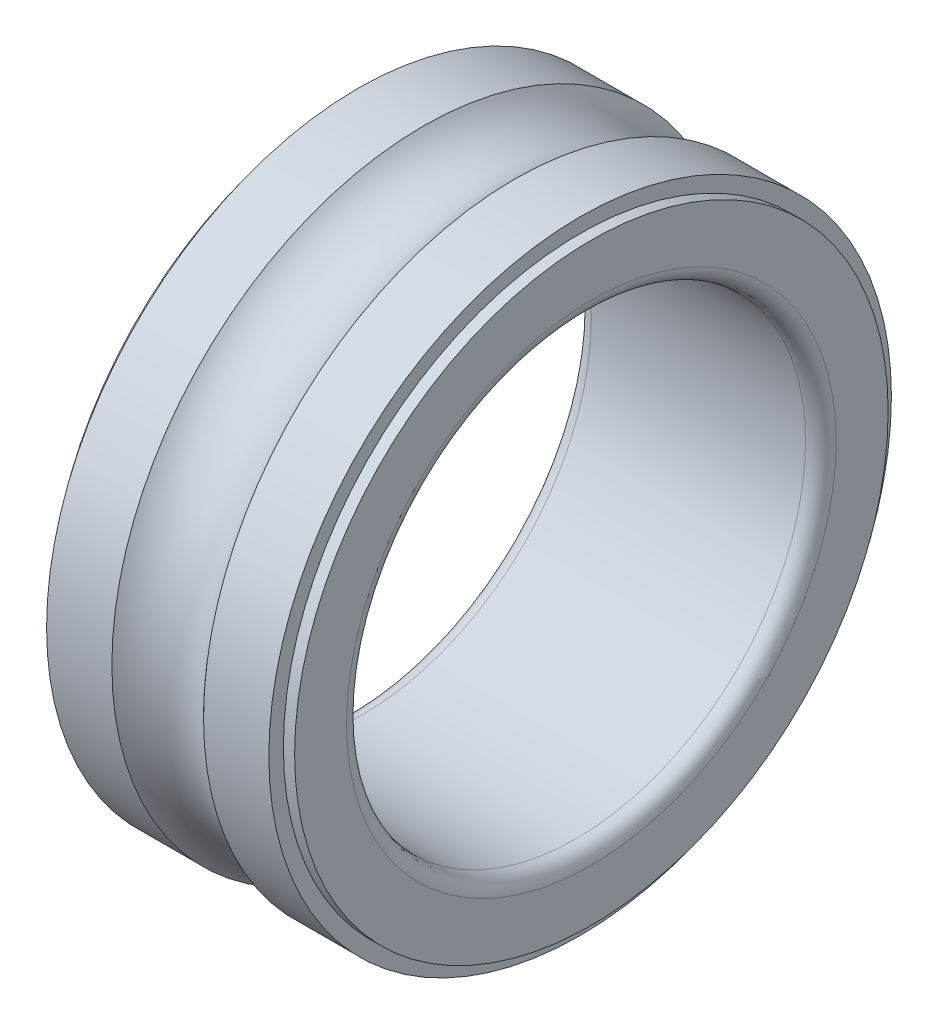
ISO-10303-21;
HEADER;
FILE_DESCRIPTION(('STEP AP214'),'2;1');
FILE_NAME('part.step','',(''),(''),'','','');
FILE_SCHEMA(('AUTOMOTIVE_DESIGN { 1 0 10303 214 1 1 1 1 }'));
ENDSEC;
DATA;
#1=APPLICATION_CONTEXT('core data for automotive mechanical design processes');
#2=APPLICATION_PROTOCOL_DEFINITION('international standard','automotive_design',2000,#1);
#3=PRODUCT_CONTEXT('',#1,'mechanical');
#4=PRODUCT('Part','Part','',(#3));
#5=PRODUCT_RELATED_PRODUCT_CATEGORY('part','',(#4));
#6=PRODUCT_DEFINITION_FORMATION('','',#4);
#7=PRODUCT_DEFINITION_CONTEXT('part definition',#1,'design');
#8=PRODUCT_DEFINITION('design','',#6,#7);
#9=PRODUCT_DEFINITION_SHAPE('','',#8);
#10=(LENGTH_UNIT() NAMED_UNIT(*) SI_UNIT(.MILLI.,.METRE.));
#11=(NAMED_UNIT(*) PLANE_ANGLE_UNIT() SI_UNIT($,.RADIAN.));
#12=(NAMED_UNIT(*) SI_UNIT($,.STERADIAN.) SOLID_ANGLE_UNIT());
#13=UNCERTAINTY_MEASURE_WITH_UNIT(LENGTH_MEASURE(1.E-05),#10,'distance_accuracy_value','');
#14=(GEOMETRIC_REPRESENTATION_CONTEXT(3) GLOBAL_UNCERTAINTY_ASSIGNED_CONTEXT((#13)) GLOBAL_UNIT_ASSIGNED_CONTEXT((#10,
#11,#12)) REPRESENTATION_CONTEXT('',''));
#15=CARTESIAN_POINT('',(0.,0.,0.));
#16=DIRECTION('',(0.,0.,1.));
#17=DIRECTION('',(1.,0.,0.));
#18=AXIS2_PLACEMENT_3D('',#15,#16,#17);
#19=CARTESIAN_POINT('',(0.,-19.76038106861,-19.4));
#20=DIRECTION('',(-1.,0.,0.));
#21=DIRECTION('',(0.,0.,1.));
#22=AXIS2_PLACEMENT_3D('',#19,#20,#21);
#23=PLANE('',#22);
#24=CARTESIAN_POINT('',(0.,0.,0.));
#25=DIRECTION('',(-1.,0.,0.));
#26=DIRECTION('',(0.,0.,-1.));
#27=AXIS2_PLACEMENT_3D('',#24,#25,#26);
#28=CIRCLE('',#27,19.4);
#29=CARTESIAN_POINT('',(0.,0.,-19.4));
#30=VERTEX_POINT('',#29);
#31=EDGE_CURVE('E56',#30,#30,#28,.F.);
#32=ORIENTED_EDGE('',*,*,#31,.F.);
#33=EDGE_LOOP('',(#32));
#34=FACE_BOUND('',#33,.T.);
#35=CARTESIAN_POINT('',(0.,0.,0.));
#36=DIRECTION('',(1.,0.,0.));
#37=DIRECTION('',(0.,0.,1.));
#38=AXIS2_PLACEMENT_3D('',#35,#36,#37);
#39=CIRCLE('',#38,15.9999999999992);
#40=CARTESIAN_POINT('',(0.,0.,15.9999999999992));
#41=VERTEX_POINT('',#40);
#42=EDGE_CURVE('E53',#41,#41,#39,.T.);
#43=ORIENTED_EDGE('',*,*,#42,.T.);
#44=EDGE_LOOP('',(#43));
#45=FACE_BOUND('',#44,.T.);
#46=ADVANCED_FACE('F15',(#34,#45),#23,.T.);
#47=CARTESIAN_POINT('',(16.,-19.76038106861,19.4));
#48=DIRECTION('',(1.,0.,0.));
#49=DIRECTION('',(0.,0.,-1.));
#50=AXIS2_PLACEMENT_3D('',#47,#48,#49);
#51=PLANE('',#50);
#52=CARTESIAN_POINT('',(16.,0.,0.));
#53=DIRECTION('',(1.,0.,0.));
#54=DIRECTION('',(0.,0.,1.));
#55=AXIS2_PLACEMENT_3D('',#52,#53,#54);
#56=CIRCLE('',#55,19.4);
#57=CARTESIAN_POINT('',(16.,0.,19.4));
#58=VERTEX_POINT('',#57);
#59=EDGE_CURVE('E50',#58,#58,#56,.T.);
#60=ORIENTED_EDGE('',*,*,#59,.T.);
#61=EDGE_LOOP('',(#60));
#62=FACE_BOUND('',#61,.T.);
#63=CARTESIAN_POINT('',(16.,0.,0.));
#64=DIRECTION('',(-1.,0.,0.));
#65=DIRECTION('',(0.,0.,-1.));
#66=AXIS2_PLACEMENT_3D('',#63,#64,#65);
#67=CIRCLE('',#66,16.0000000394232);
#68=CARTESIAN_POINT('',(16.,0.,-16.0000000394232));
#69=VERTEX_POINT('',#68);
#70=EDGE_CURVE('E47',#69,#69,#67,.F.);
#71=ORIENTED_EDGE('',*,*,#70,.F.);
#72=EDGE_LOOP('',(#71));
#73=FACE_BOUND('',#72,.T.);
#74=ADVANCED_FACE('F64',(#62,#73),#51,.T.);
#75=CARTESIAN_POINT('',(15.264,-20.7280285951657,20.35));
#76=DIRECTION('',(1.,0.,0.));
#77=DIRECTION('',(0.,0.,-1.));
#78=AXIS2_PLACEMENT_3D('',#75,#76,#77);
#79=PLANE('',#78);
#80=CARTESIAN_POINT('',(15.264,0.,0.));
#81=DIRECTION('',(1.,0.,0.));
#82=DIRECTION('',(0.,0.,1.));
#83=AXIS2_PLACEMENT_3D('',#80,#81,#82);
#84=CIRCLE('',#83,20.35);
#85=CARTESIAN_POINT('',(15.264,0.,20.35));
#86=VERTEX_POINT('',#85);
#87=EDGE_CURVE('E44',#86,#86,#84,.T.);
#88=ORIENTED_EDGE('',*,*,#87,.T.);
#89=EDGE_LOOP('',(#88));
#90=FACE_BOUND('',#89,.T.);
#91=CARTESIAN_POINT('',(15.264,0.,0.));
#92=DIRECTION('',(-1.,0.,0.));
#93=DIRECTION('',(0.,0.,-1.));
#94=AXIS2_PLACEMENT_3D('',#91,#92,#93);
#95=CIRCLE('',#94,19.4);
#96=CARTESIAN_POINT('',(15.264,0.,-19.4));
#97=VERTEX_POINT('',#96);
#98=EDGE_CURVE('E41',#97,#97,#95,.F.);
#99=ORIENTED_EDGE('',*,*,#98,.F.);
#100=EDGE_LOOP('',(#99));
#101=FACE_BOUND('',#100,.T.);
#102=ADVANCED_FACE('F82',(#90,#101),#79,.T.);
#103=CARTESIAN_POINT('',(0.736,-20.7280285951657,-20.35));
#104=DIRECTION('',(-1.,0.,0.));
#105=DIRECTION('',(0.,0.,1.));
#106=AXIS2_PLACEMENT_3D('',#103,#104,#105);
#107=PLANE('',#106);
#108=CARTESIAN_POINT('',(0.736,0.,0.));
#109=DIRECTION('',(-1.,0.,0.));
#110=DIRECTION('',(0.,0.,-1.));
#111=AXIS2_PLACEMENT_3D('',#108,#109,#110);
#112=CIRCLE('',#111,20.35);
#113=CARTESIAN_POINT('',(0.736,0.,-20.35));
#114=VERTEX_POINT('',#113);
#115=EDGE_CURVE('E38',#114,#114,#112,.F.);
#116=ORIENTED_EDGE('',*,*,#115,.F.);
#117=EDGE_LOOP('',(#116));
#118=FACE_BOUND('',#117,.T.);
#119=CARTESIAN_POINT('',(0.736,0.,0.));
#120=DIRECTION('',(1.,0.,0.));
#121=DIRECTION('',(0.,0.,1.));
#122=AXIS2_PLACEMENT_3D('',#119,#120,#121);
#123=CIRCLE('',#122,19.4);
#124=CARTESIAN_POINT('',(0.736,0.,19.4));
#125=VERTEX_POINT('',#124);
#126=EDGE_CURVE('E35',#125,#125,#123,.T.);
#127=ORIENTED_EDGE('',*,*,#126,.T.);
#128=EDGE_LOOP('',(#127));
#129=FACE_BOUND('',#128,.T.);
#130=ADVANCED_FACE('F71',(#118,#129),#107,.T.);
#131=CARTESIAN_POINT('',(0.999999999999222,0.,0.));
#132=DIRECTION('',(1.,0.,0.));
#133=DIRECTION('',(0.,0.,1.));
#134=AXIS2_PLACEMENT_3D('',#131,#132,#133);
#135=TOROIDAL_SURFACE('',#134,15.9999999999992,0.999999999999222);
#136=CARTESIAN_POINT('',(1.,0.,0.));
#137=DIRECTION('',(1.,0.,0.));
#138=DIRECTION('',(0.,0.,1.));
#139=AXIS2_PLACEMENT_3D('',#136,#137,#138);
#140=CIRCLE('',#139,15.);
#141=CARTESIAN_POINT('',(1.,0.,15.));
#142=VERTEX_POINT('',#141);
#143=EDGE_CURVE('E30',#142,#142,#140,.T.);
#144=ORIENTED_EDGE('',*,*,#143,.T.);
#145=EDGE_LOOP('',(#144));
#146=FACE_BOUND('',#145,.T.);
#147=ORIENTED_EDGE('',*,*,#42,.F.);
#148=EDGE_LOOP('',(#147));
#149=FACE_BOUND('',#148,.T.);
#150=ADVANCED_FACE('F68',(#146,#149),#135,.T.);
#151=CARTESIAN_POINT('',(16.,0.,0.));
#152=DIRECTION('',(1.,0.,0.));
#153=DIRECTION('',(0.,0.,1.));
#154=AXIS2_PLACEMENT_3D('',#151,#152,#153);
#155=CYLINDRICAL_SURFACE('',#154,15.);
#156=CARTESIAN_POINT('',(15.,0.,0.));
#157=DIRECTION('',(1.,0.,0.));
#158=DIRECTION('',(0.,0.,1.));
#159=AXIS2_PLACEMENT_3D('',#156,#157,#158);
#160=CIRCLE('',#159,15.);
#161=CARTESIAN_POINT('',(15.,0.,15.));
#162=VERTEX_POINT('',#161);
#163=EDGE_CURVE('E26',#162,#162,#160,.T.);
#164=ORIENTED_EDGE('',*,*,#163,.T.);
#165=EDGE_LOOP('',(#164));
#166=FACE_BOUND('',#165,.T.);
#167=ORIENTED_EDGE('',*,*,#143,.F.);
#168=EDGE_LOOP('',(#167));
#169=FACE_BOUND('',#168,.T.);
#170=ADVANCED_FACE('F70',(#166,#169),#155,.F.);
#171=CARTESIAN_POINT('',(15.0000000000016,0.,0.));
#172=DIRECTION('',(1.,0.,0.));
#173=DIRECTION('',(0.,0.,1.));
#174=AXIS2_PLACEMENT_3D('',#171,#172,#173);
#175=TOROIDAL_SURFACE('',#174,15.9999999999984,0.99999999999845);
#176=ORIENTED_EDGE('',*,*,#70,.T.);
#177=EDGE_LOOP('',(#176));
#178=FACE_BOUND('',#177,.T.);
#179=ORIENTED_EDGE('',*,*,#163,.F.);
#180=EDGE_LOOP('',(#179));
#181=FACE_BOUND('',#180,.T.);
#182=ADVANCED_FACE('F79',(#178,#181),#175,.T.);
#183=CARTESIAN_POINT('',(16.,0.,0.));
#184=DIRECTION('',(1.,0.,0.));
#185=DIRECTION('',(0.,0.,1.));
#186=AXIS2_PLACEMENT_3D('',#183,#184,#185);
#187=CYLINDRICAL_SURFACE('',#186,19.4);
#188=ORIENTED_EDGE('',*,*,#98,.T.);
#189=EDGE_LOOP('',(#188));
#190=FACE_BOUND('',#189,.T.);
#191=ORIENTED_EDGE('',*,*,#59,.F.);
#192=EDGE_LOOP('',(#191));
#193=FACE_BOUND('',#192,.T.);
#194=ADVANCED_FACE('F89',(#190,#193),#187,.T.);
#195=CARTESIAN_POINT('',(16.,0.,0.));
#196=DIRECTION('',(1.,0.,0.));
#197=DIRECTION('',(0.,0.,1.));
#198=AXIS2_PLACEMENT_3D('',#195,#196,#197);
#199=CYLINDRICAL_SURFACE('',#198,20.35);
#200=CARTESIAN_POINT('',(10.996247653316,0.,0.));
#201=DIRECTION('',(1.,0.,0.));
#202=DIRECTION('',(0.,0.,1.));
#203=AXIS2_PLACEMENT_3D('',#200,#201,#202);
#204=CIRCLE('',#203,20.35);
#205=CARTESIAN_POINT('',(10.996247653316,0.,20.35));
#206=VERTEX_POINT('',#205);
#207=EDGE_CURVE('E22',#206,#206,#204,.T.);
#208=ORIENTED_EDGE('',*,*,#207,.T.);
#209=EDGE_LOOP('',(#208));
#210=FACE_BOUND('',#209,.T.);
#211=ORIENTED_EDGE('',*,*,#87,.F.);
#212=EDGE_LOOP('',(#211));
#213=FACE_BOUND('',#212,.T.);
#214=ADVANCED_FACE('F93',(#210,#213),#199,.T.);
#215=CARTESIAN_POINT('',(8.00000000000015,0.,0.));
#216=DIRECTION('',(1.,0.,0.));
#217=DIRECTION('',(0.,0.,1.));
#218=AXIS2_PLACEMENT_3D('',#215,#216,#217);
#219=TOROIDAL_SURFACE('',#218,23.0000000000002,4.00000000000026);
#220=ORIENTED_EDGE('',*,*,#207,.F.);
#221=EDGE_LOOP('',(#220));
#222=FACE_BOUND('',#221,.T.);
#223=CARTESIAN_POINT('',(5.0037523466843,0.,0.));
#224=DIRECTION('',(1.,0.,0.));
#225=DIRECTION('',(0.,0.,1.));
#226=AXIS2_PLACEMENT_3D('',#223,#224,#225);
#227=CIRCLE('',#226,20.35);
#228=CARTESIAN_POINT('',(5.0037523466843,0.,20.35));
#229=VERTEX_POINT('',#228);
#230=EDGE_CURVE('E10',#229,#229,#227,.T.);
#231=ORIENTED_EDGE('',*,*,#230,.T.);
#232=EDGE_LOOP('',(#231));
#233=FACE_BOUND('',#232,.T.);
#234=ADVANCED_FACE('F97',(#222,#233),#219,.F.);
#235=CARTESIAN_POINT('',(16.,0.,0.));
#236=DIRECTION('',(1.,0.,0.));
#237=DIRECTION('',(0.,0.,1.));
#238=AXIS2_PLACEMENT_3D('',#235,#236,#237);
#239=CYLINDRICAL_SURFACE('',#238,20.35);
#240=ORIENTED_EDGE('',*,*,#115,.T.);
#241=EDGE_LOOP('',(#240));
#242=FACE_BOUND('',#241,.T.);
#243=ORIENTED_EDGE('',*,*,#230,.F.);
#244=EDGE_LOOP('',(#243));
#245=FACE_BOUND('',#244,.T.);
#246=ADVANCED_FACE('F99',(#242,#245),#239,.T.);
#247=CARTESIAN_POINT('',(16.,0.,0.));
#248=DIRECTION('',(1.,0.,0.));
#249=DIRECTION('',(0.,0.,1.));
#250=AXIS2_PLACEMENT_3D('',#247,#248,#249);
#251=CYLINDRICAL_SURFACE('',#250,19.4);
#252=ORIENTED_EDGE('',*,*,#31,.T.);
#253=EDGE_LOOP('',(#252));
#254=FACE_BOUND('',#253,.T.);
#255=ORIENTED_EDGE('',*,*,#126,.F.);
#256=EDGE_LOOP('',(#255));
#257=FACE_BOUND('',#256,.T.);
#258=ADVANCED_FACE('F17',(#254,#257),#251,.T.);
#259=CLOSED_SHELL('',(#46,#74,#102,#130,#150,#170,#182,#194,#214,#234,#246,#258));
#260=MANIFOLD_SOLID_BREP('B1',#259);
#261=ADVANCED_BREP_SHAPE_REPRESENTATION('',(#18,#260),#14);
#262=SHAPE_DEFINITION_REPRESENTATION(#9,#261);
ENDSEC;
END-ISO-10303-21;
